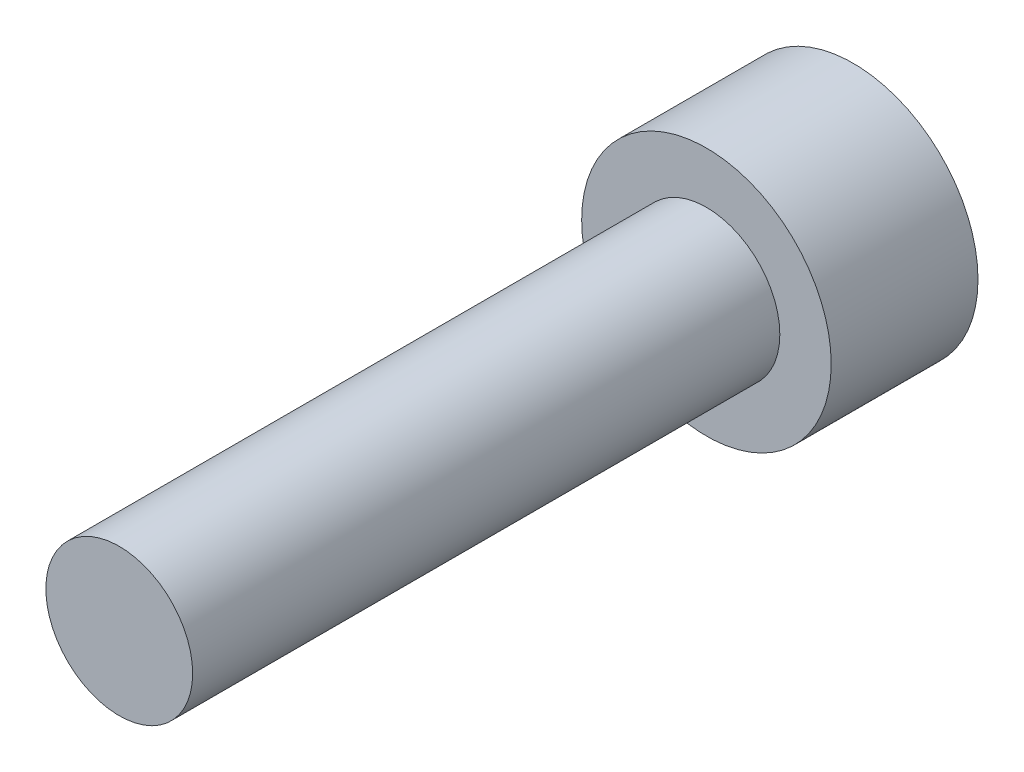
ISO-10303-21;
HEADER;
FILE_DESCRIPTION(('STEP AP214'),'2;1');
FILE_NAME('part.step','',(''),(''),'','','');
FILE_SCHEMA(('AUTOMOTIVE_DESIGN { 1 0 10303 214 1 1 1 1 }'));
ENDSEC;
DATA;
#1=APPLICATION_CONTEXT('core data for automotive mechanical design processes');
#2=APPLICATION_PROTOCOL_DEFINITION('international standard','automotive_design',2000,#1);
#3=PRODUCT_CONTEXT('',#1,'mechanical');
#4=PRODUCT('Part','Part','',(#3));
#5=PRODUCT_RELATED_PRODUCT_CATEGORY('part','',(#4));
#6=PRODUCT_DEFINITION_FORMATION('','',#4);
#7=PRODUCT_DEFINITION_CONTEXT('part definition',#1,'design');
#8=PRODUCT_DEFINITION('design','',#6,#7);
#9=PRODUCT_DEFINITION_SHAPE('','',#8);
#10=(LENGTH_UNIT() NAMED_UNIT(*) SI_UNIT(.MILLI.,.METRE.));
#11=(NAMED_UNIT(*) PLANE_ANGLE_UNIT() SI_UNIT($,.RADIAN.));
#12=(NAMED_UNIT(*) SI_UNIT($,.STERADIAN.) SOLID_ANGLE_UNIT());
#13=UNCERTAINTY_MEASURE_WITH_UNIT(LENGTH_MEASURE(1.E-05),#10,'distance_accuracy_value','');
#14=(GEOMETRIC_REPRESENTATION_CONTEXT(3) GLOBAL_UNCERTAINTY_ASSIGNED_CONTEXT((#13)) GLOBAL_UNIT_ASSIGNED_CONTEXT((#10,
#11,#12)) REPRESENTATION_CONTEXT('',''));
#15=CARTESIAN_POINT('',(0.,0.,0.));
#16=DIRECTION('',(0.,0.,1.));
#17=DIRECTION('',(1.,0.,0.));
#18=AXIS2_PLACEMENT_3D('',#15,#16,#17);
#19=CARTESIAN_POINT('',(0.,0.,5.));
#20=DIRECTION('',(0.,0.,1.));
#21=DIRECTION('',(1.,0.,0.));
#22=AXIS2_PLACEMENT_3D('',#19,#20,#21);
#23=PLANE('',#22);
#24=CARTESIAN_POINT('',(0.,0.,5.));
#25=DIRECTION('',(0.,0.,1.));
#26=DIRECTION('',(1.,0.,0.));
#27=AXIS2_PLACEMENT_3D('',#24,#25,#26);
#28=CIRCLE('',#27,4.25);
#29=CARTESIAN_POINT('',(4.25,0.,5.));
#30=VERTEX_POINT('',#29);
#31=EDGE_CURVE('E11',#30,#30,#28,.T.);
#32=ORIENTED_EDGE('',*,*,#31,.T.);
#33=EDGE_LOOP('',(#32));
#34=FACE_BOUND('',#33,.T.);
#35=CARTESIAN_POINT('',(0.,0.,5.));
#36=DIRECTION('',(0.,0.,1.));
#37=DIRECTION('',(1.,0.,0.));
#38=AXIS2_PLACEMENT_3D('',#35,#36,#37);
#39=CIRCLE('',#38,2.5);
#40=CARTESIAN_POINT('',(2.5,0.,5.));
#41=VERTEX_POINT('',#40);
#42=EDGE_CURVE('E139',#41,#41,#39,.T.);
#43=ORIENTED_EDGE('',*,*,#42,.F.);
#44=EDGE_LOOP('',(#43));
#45=FACE_BOUND('',#44,.T.);
#46=ADVANCED_FACE('F37',(#34,#45),#23,.T.);
#47=CARTESIAN_POINT('',(0.,0.,5.));
#48=DIRECTION('',(0.,0.,-1.));
#49=DIRECTION('',(-1.,0.,0.));
#50=AXIS2_PLACEMENT_3D('',#47,#48,#49);
#51=CYLINDRICAL_SURFACE('',#50,4.25);
#52=ORIENTED_EDGE('',*,*,#31,.F.);
#53=EDGE_LOOP('',(#52));
#54=FACE_BOUND('',#53,.T.);
#55=CARTESIAN_POINT('',(0.,0.,0.));
#56=DIRECTION('',(0.,0.,1.));
#57=DIRECTION('',(1.,0.,0.));
#58=AXIS2_PLACEMENT_3D('',#55,#56,#57);
#59=CIRCLE('',#58,4.25);
#60=CARTESIAN_POINT('',(4.25,0.,0.));
#61=VERTEX_POINT('',#60);
#62=EDGE_CURVE('E41',#61,#61,#59,.T.);
#63=ORIENTED_EDGE('',*,*,#62,.T.);
#64=EDGE_LOOP('',(#63));
#65=FACE_BOUND('',#64,.T.);
#66=ADVANCED_FACE('F39',(#54,#65),#51,.T.);
#67=CARTESIAN_POINT('',(0.,0.,0.));
#68=DIRECTION('',(0.,0.,1.));
#69=DIRECTION('',(1.,0.,0.));
#70=AXIS2_PLACEMENT_3D('',#67,#68,#69);
#71=PLANE('',#70);
#72=DIRECTION('',(0.102449727883256,0.994738183270677,0.));
#73=VECTOR('',#72,1.);
#74=CARTESIAN_POINT('',(-2.48124722621836,-1.11094189257384,0.));
#75=LINE('',#74,#73);
#76=CARTESIAN_POINT('',(-2.48124722621836,-1.11094189257384,0.));
#77=VERTEX_POINT('',#76);
#78=CARTESIAN_POINT('',(-2.20272751420649,1.59335218468785,0.));
#79=VERTEX_POINT('',#78);
#80=EDGE_CURVE('E126',#77,#79,#75,.T.);
#81=ORIENTED_EDGE('',*,*,#80,.F.);
#82=DIRECTION('',(-0.810243672885159,0.586093158593041,0.));
#83=VECTOR('',#82,1.);
#84=CARTESIAN_POINT('',(-0.278519712011871,-2.70429407726169,0.));
#85=LINE('',#84,#83);
#86=CARTESIAN_POINT('',(-0.278519712011871,-2.70429407726169,0.));
#87=VERTEX_POINT('',#86);
#88=EDGE_CURVE('E52',#87,#77,#85,.T.);
#89=ORIENTED_EDGE('',*,*,#88,.F.);
#90=DIRECTION('',(-0.912693400768415,-0.408645024677636,0.));
#91=VECTOR('',#90,1.);
#92=CARTESIAN_POINT('',(2.20272751420649,-1.59335218468785,0.));
#93=LINE('',#92,#91);
#94=CARTESIAN_POINT('',(2.20272751420649,-1.59335218468785,0.));
#95=VERTEX_POINT('',#94);
#96=EDGE_CURVE('E135',#95,#87,#93,.T.);
#97=ORIENTED_EDGE('',*,*,#96,.F.);
#98=DIRECTION('',(-0.102449727883256,-0.994738183270677,0.));
#99=VECTOR('',#98,1.);
#100=CARTESIAN_POINT('',(2.48124722621836,1.11094189257384,0.));
#101=LINE('',#100,#99);
#102=CARTESIAN_POINT('',(2.48124722621836,1.11094189257384,0.));
#103=VERTEX_POINT('',#102);
#104=EDGE_CURVE('E133',#103,#95,#101,.T.);
#105=ORIENTED_EDGE('',*,*,#104,.F.);
#106=DIRECTION('',(0.810243672885159,-0.586093158593041,0.));
#107=VECTOR('',#106,1.);
#108=CARTESIAN_POINT('',(0.278519712011872,2.70429407726169,0.));
#109=LINE('',#108,#107);
#110=CARTESIAN_POINT('',(0.278519712011872,2.70429407726169,0.));
#111=VERTEX_POINT('',#110);
#112=EDGE_CURVE('E100',#111,#103,#109,.T.);
#113=ORIENTED_EDGE('',*,*,#112,.F.);
#114=DIRECTION('',(0.912693400768415,0.408645024677636,0.));
#115=VECTOR('',#114,1.);
#116=CARTESIAN_POINT('',(-2.20272751420649,1.59335218468785,0.));
#117=LINE('',#116,#115);
#118=EDGE_CURVE('E129',#79,#111,#117,.T.);
#119=ORIENTED_EDGE('',*,*,#118,.F.);
#120=EDGE_LOOP('',(#81,#89,#97,#105,#113,#119));
#121=FACE_BOUND('',#120,.T.);
#122=ORIENTED_EDGE('',*,*,#62,.F.);
#123=EDGE_LOOP('',(#122));
#124=FACE_BOUND('',#123,.T.);
#125=ADVANCED_FACE('F159',(#121,#124),#71,.F.);
#126=CARTESIAN_POINT('',(0.,0.,25.));
#127=DIRECTION('',(0.,0.,-1.));
#128=DIRECTION('',(-1.,0.,0.));
#129=AXIS2_PLACEMENT_3D('',#126,#127,#128);
#130=CYLINDRICAL_SURFACE('',#129,2.5);
#131=CARTESIAN_POINT('',(0.,0.,25.));
#132=DIRECTION('',(0.,0.,1.));
#133=DIRECTION('',(1.,0.,0.));
#134=AXIS2_PLACEMENT_3D('',#131,#132,#133);
#135=CIRCLE('',#134,2.5);
#136=CARTESIAN_POINT('',(2.5,0.,25.));
#137=VERTEX_POINT('',#136);
#138=EDGE_CURVE('E145',#137,#137,#135,.T.);
#139=ORIENTED_EDGE('',*,*,#138,.F.);
#140=EDGE_LOOP('',(#139));
#141=FACE_BOUND('',#140,.T.);
#142=ORIENTED_EDGE('',*,*,#42,.T.);
#143=EDGE_LOOP('',(#142));
#144=FACE_BOUND('',#143,.T.);
#145=ADVANCED_FACE('F151',(#141,#144),#130,.T.);
#146=CARTESIAN_POINT('',(0.,0.,25.));
#147=DIRECTION('',(0.,0.,1.));
#148=DIRECTION('',(1.,0.,0.));
#149=AXIS2_PLACEMENT_3D('',#146,#147,#148);
#150=PLANE('',#149);
#151=ORIENTED_EDGE('',*,*,#138,.T.);
#152=EDGE_LOOP('',(#151));
#153=FACE_BOUND('',#152,.T.);
#154=ADVANCED_FACE('F168',(#153),#150,.T.);
#155=CARTESIAN_POINT('',(-0.278519712011871,-2.70429407726169,2.));
#156=DIRECTION('',(-0.586093158593041,-0.810243672885159,0.));
#157=DIRECTION('',(0.810243672885159,-0.586093158593041,0.));
#158=AXIS2_PLACEMENT_3D('',#155,#156,#157);
#159=PLANE('',#158);
#160=ORIENTED_EDGE('',*,*,#88,.T.);
#161=DIRECTION('',(0.,0.,-1.));
#162=VECTOR('',#161,1.);
#163=CARTESIAN_POINT('',(-2.48124722621836,-1.11094189257384,2.));
#164=LINE('',#163,#162);
#165=CARTESIAN_POINT('',(-2.48124722621836,-1.11094189257384,2.));
#166=VERTEX_POINT('',#165);
#167=EDGE_CURVE('E82',#166,#77,#164,.T.);
#168=ORIENTED_EDGE('',*,*,#167,.F.);
#169=DIRECTION('',(-0.810243672885159,0.586093158593041,0.));
#170=VECTOR('',#169,1.);
#171=CARTESIAN_POINT('',(-0.278519712011871,-2.70429407726169,2.));
#172=LINE('',#171,#170);
#173=CARTESIAN_POINT('',(-0.278519712011871,-2.70429407726169,2.));
#174=VERTEX_POINT('',#173);
#175=EDGE_CURVE('E137',#174,#166,#172,.T.);
#176=ORIENTED_EDGE('',*,*,#175,.F.);
#177=DIRECTION('',(0.,0.,-1.));
#178=VECTOR('',#177,1.);
#179=CARTESIAN_POINT('',(-0.278519712011871,-2.70429407726169,2.));
#180=LINE('',#179,#178);
#181=EDGE_CURVE('E60',#174,#87,#180,.T.);
#182=ORIENTED_EDGE('',*,*,#181,.T.);
#183=EDGE_LOOP('',(#160,#168,#176,#182));
#184=FACE_BOUND('',#183,.T.);
#185=ADVANCED_FACE('F180',(#184),#159,.F.);
#186=CARTESIAN_POINT('',(2.20272751420649,-1.59335218468785,2.));
#187=DIRECTION('',(0.408645024677636,-0.912693400768415,0.));
#188=DIRECTION('',(0.912693400768415,0.408645024677636,0.));
#189=AXIS2_PLACEMENT_3D('',#186,#187,#188);
#190=PLANE('',#189);
#191=ORIENTED_EDGE('',*,*,#96,.T.);
#192=ORIENTED_EDGE('',*,*,#181,.F.);
#193=DIRECTION('',(-0.912693400768415,-0.408645024677636,0.));
#194=VECTOR('',#193,1.);
#195=CARTESIAN_POINT('',(2.20272751420649,-1.59335218468785,2.));
#196=LINE('',#195,#194);
#197=CARTESIAN_POINT('',(2.20272751420649,-1.59335218468785,2.));
#198=VERTEX_POINT('',#197);
#199=EDGE_CURVE('E112',#198,#174,#196,.T.);
#200=ORIENTED_EDGE('',*,*,#199,.F.);
#201=DIRECTION('',(0.,0.,-1.));
#202=VECTOR('',#201,1.);
#203=CARTESIAN_POINT('',(2.20272751420649,-1.59335218468785,2.));
#204=LINE('',#203,#202);
#205=EDGE_CURVE('E104',#198,#95,#204,.T.);
#206=ORIENTED_EDGE('',*,*,#205,.T.);
#207=EDGE_LOOP('',(#191,#192,#200,#206));
#208=FACE_BOUND('',#207,.T.);
#209=ADVANCED_FACE('F182',(#208),#190,.F.);
#210=CARTESIAN_POINT('',(2.48124722621836,1.11094189257384,2.));
#211=DIRECTION('',(0.994738183270677,-0.102449727883256,0.));
#212=DIRECTION('',(0.102449727883256,0.994738183270677,0.));
#213=AXIS2_PLACEMENT_3D('',#210,#211,#212);
#214=PLANE('',#213);
#215=ORIENTED_EDGE('',*,*,#104,.T.);
#216=ORIENTED_EDGE('',*,*,#205,.F.);
#217=DIRECTION('',(-0.102449727883256,-0.994738183270677,0.));
#218=VECTOR('',#217,1.);
#219=CARTESIAN_POINT('',(2.48124722621836,1.11094189257384,2.));
#220=LINE('',#219,#218);
#221=CARTESIAN_POINT('',(2.48124722621836,1.11094189257384,2.));
#222=VERTEX_POINT('',#221);
#223=EDGE_CURVE('E108',#222,#198,#220,.T.);
#224=ORIENTED_EDGE('',*,*,#223,.F.);
#225=DIRECTION('',(0.,0.,-1.));
#226=VECTOR('',#225,1.);
#227=CARTESIAN_POINT('',(2.48124722621836,1.11094189257384,2.));
#228=LINE('',#227,#226);
#229=EDGE_CURVE('E93',#222,#103,#228,.T.);
#230=ORIENTED_EDGE('',*,*,#229,.T.);
#231=EDGE_LOOP('',(#215,#216,#224,#230));
#232=FACE_BOUND('',#231,.T.);
#233=ADVANCED_FACE('F109',(#232),#214,.F.);
#234=CARTESIAN_POINT('',(0.278519712011872,2.70429407726169,2.));
#235=DIRECTION('',(0.586093158593041,0.810243672885159,0.));
#236=DIRECTION('',(-0.810243672885159,0.586093158593041,0.));
#237=AXIS2_PLACEMENT_3D('',#234,#235,#236);
#238=PLANE('',#237);
#239=ORIENTED_EDGE('',*,*,#112,.T.);
#240=ORIENTED_EDGE('',*,*,#229,.F.);
#241=DIRECTION('',(0.810243672885159,-0.586093158593041,0.));
#242=VECTOR('',#241,1.);
#243=CARTESIAN_POINT('',(0.278519712011872,2.70429407726169,2.));
#244=LINE('',#243,#242);
#245=CARTESIAN_POINT('',(0.278519712011872,2.70429407726169,2.));
#246=VERTEX_POINT('',#245);
#247=EDGE_CURVE('E97',#246,#222,#244,.T.);
#248=ORIENTED_EDGE('',*,*,#247,.F.);
#249=DIRECTION('',(0.,0.,-1.));
#250=VECTOR('',#249,1.);
#251=CARTESIAN_POINT('',(0.278519712011872,2.70429407726169,2.));
#252=LINE('',#251,#250);
#253=EDGE_CURVE('E105',#246,#111,#252,.T.);
#254=ORIENTED_EDGE('',*,*,#253,.T.);
#255=EDGE_LOOP('',(#239,#240,#248,#254));
#256=FACE_BOUND('',#255,.T.);
#257=ADVANCED_FACE('F95',(#256),#238,.F.);
#258=CARTESIAN_POINT('',(-2.20272751420649,1.59335218468785,2.));
#259=DIRECTION('',(-0.408645024677636,0.912693400768415,0.));
#260=DIRECTION('',(-0.912693400768415,-0.408645024677636,0.));
#261=AXIS2_PLACEMENT_3D('',#258,#259,#260);
#262=PLANE('',#261);
#263=ORIENTED_EDGE('',*,*,#118,.T.);
#264=ORIENTED_EDGE('',*,*,#253,.F.);
#265=DIRECTION('',(0.912693400768415,0.408645024677636,0.));
#266=VECTOR('',#265,1.);
#267=CARTESIAN_POINT('',(-2.20272751420649,1.59335218468785,2.));
#268=LINE('',#267,#266);
#269=CARTESIAN_POINT('',(-2.20272751420649,1.59335218468785,2.));
#270=VERTEX_POINT('',#269);
#271=EDGE_CURVE('E118',#270,#246,#268,.T.);
#272=ORIENTED_EDGE('',*,*,#271,.F.);
#273=DIRECTION('',(0.,0.,-1.));
#274=VECTOR('',#273,1.);
#275=CARTESIAN_POINT('',(-2.20272751420649,1.59335218468785,2.));
#276=LINE('',#275,#274);
#277=EDGE_CURVE('E142',#270,#79,#276,.T.);
#278=ORIENTED_EDGE('',*,*,#277,.T.);
#279=EDGE_LOOP('',(#263,#264,#272,#278));
#280=FACE_BOUND('',#279,.T.);
#281=ADVANCED_FACE('F193',(#280),#262,.F.);
#282=CARTESIAN_POINT('',(-2.48124722621836,-1.11094189257384,2.));
#283=DIRECTION('',(-0.994738183270677,0.102449727883256,0.));
#284=DIRECTION('',(-0.102449727883256,-0.994738183270677,0.));
#285=AXIS2_PLACEMENT_3D('',#282,#283,#284);
#286=PLANE('',#285);
#287=ORIENTED_EDGE('',*,*,#80,.T.);
#288=ORIENTED_EDGE('',*,*,#277,.F.);
#289=DIRECTION('',(0.102449727883256,0.994738183270677,0.));
#290=VECTOR('',#289,1.);
#291=CARTESIAN_POINT('',(-2.48124722621836,-1.11094189257384,2.));
#292=LINE('',#291,#290);
#293=EDGE_CURVE('E120',#166,#270,#292,.T.);
#294=ORIENTED_EDGE('',*,*,#293,.F.);
#295=ORIENTED_EDGE('',*,*,#167,.T.);
#296=EDGE_LOOP('',(#287,#288,#294,#295));
#297=FACE_BOUND('',#296,.T.);
#298=ADVANCED_FACE('F178',(#297),#286,.F.);
#299=CARTESIAN_POINT('',(0.,0.,2.));
#300=DIRECTION('',(0.,0.,-1.));
#301=DIRECTION('',(-1.,0.,0.));
#302=AXIS2_PLACEMENT_3D('',#299,#300,#301);
#303=PLANE('',#302);
#304=ORIENTED_EDGE('',*,*,#175,.T.);
#305=ORIENTED_EDGE('',*,*,#293,.T.);
#306=ORIENTED_EDGE('',*,*,#271,.T.);
#307=ORIENTED_EDGE('',*,*,#247,.T.);
#308=ORIENTED_EDGE('',*,*,#223,.T.);
#309=ORIENTED_EDGE('',*,*,#199,.T.);
#310=EDGE_LOOP('',(#304,#305,#306,#307,#308,#309));
#311=FACE_BOUND('',#310,.T.);
#312=ADVANCED_FACE('F115',(#311),#303,.T.);
#313=CLOSED_SHELL('',(#46,#66,#125,#145,#154,#185,#209,#233,#257,#281,#298,#312));
#314=MANIFOLD_SOLID_BREP('B2',#313);
#315=ADVANCED_BREP_SHAPE_REPRESENTATION('',(#18,#314),#14);
#316=SHAPE_DEFINITION_REPRESENTATION(#9,#315);
ENDSEC;
END-ISO-10303-21;
